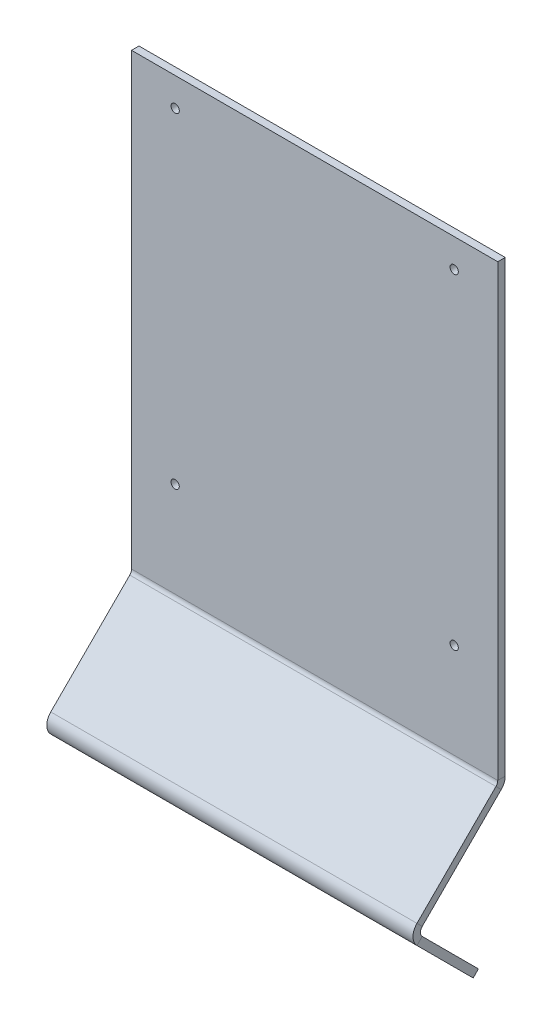
ISO-10303-21;
HEADER;
FILE_DESCRIPTION(('STEP AP214'),'2;1');
FILE_NAME('part.step','',(''),(''),'','','');
FILE_SCHEMA(('AUTOMOTIVE_DESIGN { 1 0 10303 214 1 1 1 1 }'));
ENDSEC;
DATA;
#1=APPLICATION_CONTEXT('core data for automotive mechanical design processes');
#2=APPLICATION_PROTOCOL_DEFINITION('international standard','automotive_design',2000,#1);
#3=PRODUCT_CONTEXT('',#1,'mechanical');
#4=PRODUCT('Part','Part','',(#3));
#5=PRODUCT_RELATED_PRODUCT_CATEGORY('part','',(#4));
#6=PRODUCT_DEFINITION_FORMATION('','',#4);
#7=PRODUCT_DEFINITION_CONTEXT('part definition',#1,'design');
#8=PRODUCT_DEFINITION('design','',#6,#7);
#9=PRODUCT_DEFINITION_SHAPE('','',#8);
#10=(LENGTH_UNIT() NAMED_UNIT(*) SI_UNIT(.MILLI.,.METRE.));
#11=(NAMED_UNIT(*) PLANE_ANGLE_UNIT() SI_UNIT($,.RADIAN.));
#12=(NAMED_UNIT(*) SI_UNIT($,.STERADIAN.) SOLID_ANGLE_UNIT());
#13=UNCERTAINTY_MEASURE_WITH_UNIT(LENGTH_MEASURE(1.E-05),#10,'distance_accuracy_value','');
#14=(GEOMETRIC_REPRESENTATION_CONTEXT(3) GLOBAL_UNCERTAINTY_ASSIGNED_CONTEXT((#13)) GLOBAL_UNIT_ASSIGNED_CONTEXT((#10,
#11,#12)) REPRESENTATION_CONTEXT('',''));
#15=CARTESIAN_POINT('',(0.,0.,0.));
#16=DIRECTION('',(0.,0.,1.));
#17=DIRECTION('',(1.,0.,0.));
#18=AXIS2_PLACEMENT_3D('',#15,#16,#17);
#19=CARTESIAN_POINT('',(0.,-35.7337523480089,-87.6359287137892));
#20=DIRECTION('',(0.,-0.707106781186549,-0.707106781186546));
#21=DIRECTION('',(-1.,0.,0.));
#22=AXIS2_PLACEMENT_3D('',#19,#20,#21);
#23=PLANE('',#22);
#24=DIRECTION('',(0.,-0.707106781186546,0.707106781186549));
#25=VECTOR('',#24,1.);
#26=CARTESIAN_POINT('',(0.,-35.7337523480089,-87.6359287137892));
#27=LINE('',#26,#25);
#28=CARTESIAN_POINT('',(0.,-123.860687253817,0.491006192018879));
#29=VERTEX_POINT('',#28);
#30=CARTESIAN_POINT('',(0.,-145.436843709626,22.0671626478287));
#31=VERTEX_POINT('',#30);
#32=EDGE_CURVE('E70',#29,#31,#27,.T.);
#33=ORIENTED_EDGE('',*,*,#32,.T.);
#34=DIRECTION('',(1.,0.,0.));
#35=VECTOR('',#34,1.);
#36=CARTESIAN_POINT('',(0.,-145.436843709626,22.0671626478287));
#37=LINE('',#36,#35);
#38=CARTESIAN_POINT('',(100.,-145.436843709626,22.0671626478287));
#39=VERTEX_POINT('',#38);
#40=EDGE_CURVE('E62',#31,#39,#37,.T.);
#41=ORIENTED_EDGE('',*,*,#40,.T.);
#42=DIRECTION('',(0.,-0.707106781186546,0.707106781186549));
#43=VECTOR('',#42,1.);
#44=CARTESIAN_POINT('',(100.,-35.7337523480089,-87.6359287137892));
#45=LINE('',#44,#43);
#46=CARTESIAN_POINT('',(100.,-123.860687253817,0.491006192018879));
#47=VERTEX_POINT('',#46);
#48=EDGE_CURVE('E78',#47,#39,#45,.T.);
#49=ORIENTED_EDGE('',*,*,#48,.F.);
#50=DIRECTION('',(1.,0.,0.));
#51=VECTOR('',#50,1.);
#52=CARTESIAN_POINT('',(0.,-123.860687253817,0.491006192018875));
#53=LINE('',#52,#51);
#54=EDGE_CURVE('E242',#29,#47,#53,.T.);
#55=ORIENTED_EDGE('',*,*,#54,.F.);
#56=EDGE_LOOP('',(#33,#41,#49,#55));
#57=FACE_BOUND('',#56,.T.);
#58=ADVANCED_FACE('F53',(#57),#23,.F.);
#59=CARTESIAN_POINT('',(100.,-37.1705933273799,-89.0727696931603));
#60=DIRECTION('',(-1.,0.,0.));
#61=DIRECTION('',(0.,-0.707106781186546,0.707106781186549));
#62=AXIS2_PLACEMENT_3D('',#59,#60,#61);
#63=PLANE('',#62);
#64=ORIENTED_EDGE('',*,*,#48,.T.);
#65=DIRECTION('',(0.,-0.707106781186549,-0.707106781186546));
#66=VECTOR('',#65,1.);
#67=CARTESIAN_POINT('',(100.,-146.873684688997,20.6303216684576));
#68=LINE('',#67,#66);
#69=CARTESIAN_POINT('',(100.,-146.873684688997,20.6303216684576));
#70=VERTEX_POINT('',#69);
#71=EDGE_CURVE('E250',#39,#70,#68,.T.);
#72=ORIENTED_EDGE('',*,*,#71,.T.);
#73=DIRECTION('',(0.,-0.707106781186546,0.707106781186549));
#74=VECTOR('',#73,1.);
#75=CARTESIAN_POINT('',(100.,-37.1705933273799,-89.0727696931603));
#76=LINE('',#75,#74);
#77=CARTESIAN_POINT('',(100.,-125.297528233188,-0.94583478735219));
#78=VERTEX_POINT('',#77);
#79=EDGE_CURVE('E57',#78,#70,#76,.T.);
#80=ORIENTED_EDGE('',*,*,#79,.F.);
#81=DIRECTION('',(0.,-0.707106781186544,-0.707106781186551));
#82=VECTOR('',#81,1.);
#83=CARTESIAN_POINT('',(100.,-125.297528233188,-0.945834787352801));
#84=LINE('',#83,#82);
#85=EDGE_CURVE('E244',#47,#78,#84,.T.);
#86=ORIENTED_EDGE('',*,*,#85,.F.);
#87=EDGE_LOOP('',(#64,#72,#80,#86));
#88=FACE_BOUND('',#87,.T.);
#89=ADVANCED_FACE('F260',(#88),#63,.F.);
#90=CARTESIAN_POINT('',(0.,-37.1705933273799,-89.0727696931603));
#91=DIRECTION('',(-1.,0.,0.));
#92=DIRECTION('',(0.,-0.707106781186546,0.707106781186549));
#93=AXIS2_PLACEMENT_3D('',#90,#91,#92);
#94=PLANE('',#93);
#95=DIRECTION('',(0.,-0.707106781186549,-0.707106781186546));
#96=VECTOR('',#95,1.);
#97=CARTESIAN_POINT('',(0.,-146.873684688997,20.6303216684576));
#98=LINE('',#97,#96);
#99=CARTESIAN_POINT('',(0.,-146.873684688997,20.6303216684576));
#100=VERTEX_POINT('',#99);
#101=EDGE_CURVE('E12',#31,#100,#98,.T.);
#102=ORIENTED_EDGE('',*,*,#101,.F.);
#103=ORIENTED_EDGE('',*,*,#32,.F.);
#104=DIRECTION('',(0.,-0.707106781186544,-0.707106781186551));
#105=VECTOR('',#104,1.);
#106=CARTESIAN_POINT('',(0.,-125.297528233188,-0.945834787352801));
#107=LINE('',#106,#105);
#108=CARTESIAN_POINT('',(0.,-125.297528233188,-0.94583478735218));
#109=VERTEX_POINT('',#108);
#110=EDGE_CURVE('E238',#29,#109,#107,.T.);
#111=ORIENTED_EDGE('',*,*,#110,.T.);
#112=DIRECTION('',(0.,-0.707106781186546,0.707106781186549));
#113=VECTOR('',#112,1.);
#114=CARTESIAN_POINT('',(0.,-37.1705933273799,-89.0727696931603));
#115=LINE('',#114,#113);
#116=EDGE_CURVE('E239',#109,#100,#115,.T.);
#117=ORIENTED_EDGE('',*,*,#116,.T.);
#118=EDGE_LOOP('',(#102,#103,#111,#117));
#119=FACE_BOUND('',#118,.T.);
#120=ADVANCED_FACE('F55',(#119),#94,.T.);
#121=CARTESIAN_POINT('',(0.,-37.1705933273799,-89.0727696931603));
#122=DIRECTION('',(0.,-0.707106781186549,-0.707106781186546));
#123=DIRECTION('',(-1.,0.,0.));
#124=AXIS2_PLACEMENT_3D('',#121,#122,#123);
#125=PLANE('',#124);
#126=DIRECTION('',(1.,0.,0.));
#127=VECTOR('',#126,1.);
#128=CARTESIAN_POINT('',(0.,-146.873684688997,20.6303216684576));
#129=LINE('',#128,#127);
#130=EDGE_CURVE('E247',#100,#70,#129,.T.);
#131=ORIENTED_EDGE('',*,*,#130,.F.);
#132=ORIENTED_EDGE('',*,*,#116,.F.);
#133=DIRECTION('',(1.,0.,0.));
#134=VECTOR('',#133,1.);
#135=CARTESIAN_POINT('',(0.,-125.297528233188,-0.94583478735219));
#136=LINE('',#135,#134);
#137=EDGE_CURVE('E235',#109,#78,#136,.T.);
#138=ORIENTED_EDGE('',*,*,#137,.T.);
#139=ORIENTED_EDGE('',*,*,#79,.T.);
#140=EDGE_LOOP('',(#131,#132,#138,#139));
#141=FACE_BOUND('',#140,.T.);
#142=ADVANCED_FACE('F257',(#141),#125,.T.);
#143=CARTESIAN_POINT('',(0.,0.,-2.032));
#144=DIRECTION('',(0.,-1.,0.));
#145=DIRECTION('',(0.,0.,-1.));
#146=AXIS2_PLACEMENT_3D('',#143,#144,#145);
#147=PLANE('',#146);
#148=DIRECTION('',(1.,0.,0.));
#149=VECTOR('',#148,1.);
#150=CARTESIAN_POINT('',(0.,0.,0.));
#151=LINE('',#150,#149);
#152=CARTESIAN_POINT('',(0.,0.,0.));
#153=VERTEX_POINT('',#152);
#154=CARTESIAN_POINT('',(100.,0.,0.));
#155=VERTEX_POINT('',#154);
#156=EDGE_CURVE('E228',#153,#155,#151,.T.);
#157=ORIENTED_EDGE('',*,*,#156,.T.);
#158=DIRECTION('',(0.,0.,1.));
#159=VECTOR('',#158,1.);
#160=CARTESIAN_POINT('',(100.,0.,-2.032));
#161=LINE('',#160,#159);
#162=CARTESIAN_POINT('',(100.,0.,-2.032));
#163=VERTEX_POINT('',#162);
#164=EDGE_CURVE('E207',#163,#155,#161,.T.);
#165=ORIENTED_EDGE('',*,*,#164,.F.);
#166=DIRECTION('',(1.,0.,0.));
#167=VECTOR('',#166,1.);
#168=CARTESIAN_POINT('',(0.,0.,-2.032));
#169=LINE('',#168,#167);
#170=CARTESIAN_POINT('',(0.,0.,-2.032));
#171=VERTEX_POINT('',#170);
#172=EDGE_CURVE('E224',#171,#163,#169,.T.);
#173=ORIENTED_EDGE('',*,*,#172,.F.);
#174=DIRECTION('',(0.,0.,1.));
#175=VECTOR('',#174,1.);
#176=CARTESIAN_POINT('',(0.,0.,-2.032));
#177=LINE('',#176,#175);
#178=EDGE_CURVE('E226',#171,#153,#177,.T.);
#179=ORIENTED_EDGE('',*,*,#178,.T.);
#180=EDGE_LOOP('',(#157,#165,#173,#179));
#181=FACE_BOUND('',#180,.T.);
#182=ADVANCED_FACE('F362',(#181),#147,.F.);
#183=CARTESIAN_POINT('',(0.,0.,-2.032));
#184=DIRECTION('',(0.,0.,-1.));
#185=DIRECTION('',(-1.,0.,0.));
#186=AXIS2_PLACEMENT_3D('',#183,#184,#185);
#187=PLANE('',#186);
#188=CARTESIAN_POINT('',(88.1,-96.6868,-2.032));
#189=DIRECTION('',(0.,0.,1.));
#190=DIRECTION('',(1.,0.,0.));
#191=AXIS2_PLACEMENT_3D('',#188,#189,#190);
#192=CIRCLE('',#191,1.1303);
#193=CARTESIAN_POINT('',(89.2303,-96.6868,-2.032));
#194=VERTEX_POINT('',#193);
#195=EDGE_CURVE('E305',#194,#194,#192,.T.);
#196=ORIENTED_EDGE('',*,*,#195,.T.);
#197=EDGE_LOOP('',(#196));
#198=FACE_BOUND('',#197,.T.);
#199=CARTESIAN_POINT('',(11.9,-96.6868,-2.032));
#200=DIRECTION('',(0.,0.,1.));
#201=DIRECTION('',(1.,0.,0.));
#202=AXIS2_PLACEMENT_3D('',#199,#200,#201);
#203=CIRCLE('',#202,1.1303);
#204=CARTESIAN_POINT('',(13.0303,-96.6868,-2.032));
#205=VERTEX_POINT('',#204);
#206=EDGE_CURVE('E299',#205,#205,#203,.T.);
#207=ORIENTED_EDGE('',*,*,#206,.T.);
#208=EDGE_LOOP('',(#207));
#209=FACE_BOUND('',#208,.T.);
#210=CARTESIAN_POINT('',(11.9,-7.7868,-2.032));
#211=DIRECTION('',(0.,0.,1.));
#212=DIRECTION('',(1.,0.,0.));
#213=AXIS2_PLACEMENT_3D('',#210,#211,#212);
#214=CIRCLE('',#213,1.1303);
#215=CARTESIAN_POINT('',(13.0303,-7.7868,-2.032));
#216=VERTEX_POINT('',#215);
#217=EDGE_CURVE('E293',#216,#216,#214,.T.);
#218=ORIENTED_EDGE('',*,*,#217,.T.);
#219=EDGE_LOOP('',(#218));
#220=FACE_BOUND('',#219,.T.);
#221=CARTESIAN_POINT('',(88.1,-7.78679999999999,-2.032));
#222=DIRECTION('',(0.,0.,1.));
#223=DIRECTION('',(1.,0.,0.));
#224=AXIS2_PLACEMENT_3D('',#221,#222,#223);
#225=CIRCLE('',#224,1.1303);
#226=CARTESIAN_POINT('',(89.2303,-7.78679999999999,-2.032));
#227=VERTEX_POINT('',#226);
#228=EDGE_CURVE('E183',#227,#227,#225,.T.);
#229=ORIENTED_EDGE('',*,*,#228,.T.);
#230=EDGE_LOOP('',(#229));
#231=FACE_BOUND('',#230,.T.);
#232=DIRECTION('',(1.,0.,0.));
#233=VECTOR('',#232,1.);
#234=CARTESIAN_POINT('',(0.,-122.675293445836,-2.032));
#235=LINE('',#234,#233);
#236=CARTESIAN_POINT('',(0.,-122.675293445836,-2.032));
#237=VERTEX_POINT('',#236);
#238=CARTESIAN_POINT('',(100.,-122.675293445836,-2.032));
#239=VERTEX_POINT('',#238);
#240=EDGE_CURVE('E202',#237,#239,#235,.T.);
#241=ORIENTED_EDGE('',*,*,#240,.F.);
#242=DIRECTION('',(0.,-1.,0.));
#243=VECTOR('',#242,1.);
#244=CARTESIAN_POINT('',(0.,0.,-2.032));
#245=LINE('',#244,#243);
#246=EDGE_CURVE('E220',#171,#237,#245,.T.);
#247=ORIENTED_EDGE('',*,*,#246,.F.);
#248=ORIENTED_EDGE('',*,*,#172,.T.);
#249=DIRECTION('',(0.,-1.,0.));
#250=VECTOR('',#249,1.);
#251=CARTESIAN_POINT('',(100.,0.,-2.032));
#252=LINE('',#251,#250);
#253=EDGE_CURVE('E222',#163,#239,#252,.T.);
#254=ORIENTED_EDGE('',*,*,#253,.T.);
#255=EDGE_LOOP('',(#241,#247,#248,#254));
#256=FACE_BOUND('',#255,.T.);
#257=ADVANCED_FACE('F375',(#198,#209,#220,#231,#256),#187,.T.);
#258=CARTESIAN_POINT('',(0.,0.,-2.032));
#259=DIRECTION('',(-1.,0.,0.));
#260=DIRECTION('',(0.,-1.,0.));
#261=AXIS2_PLACEMENT_3D('',#258,#259,#260);
#262=PLANE('',#261);
#263=DIRECTION('',(0.,0.,-1.));
#264=VECTOR('',#263,1.);
#265=CARTESIAN_POINT('',(0.,-122.675293445836,-2.03200000000086));
#266=LINE('',#265,#264);
#267=CARTESIAN_POINT('',(0.,-122.675293445836,0.));
#268=VERTEX_POINT('',#267);
#269=EDGE_CURVE('E230',#268,#237,#266,.T.);
#270=ORIENTED_EDGE('',*,*,#269,.F.);
#271=DIRECTION('',(0.,-1.,0.));
#272=VECTOR('',#271,1.);
#273=CARTESIAN_POINT('',(0.,0.,0.));
#274=LINE('',#273,#272);
#275=EDGE_CURVE('E218',#153,#268,#274,.T.);
#276=ORIENTED_EDGE('',*,*,#275,.F.);
#277=ORIENTED_EDGE('',*,*,#178,.F.);
#278=ORIENTED_EDGE('',*,*,#246,.T.);
#279=EDGE_LOOP('',(#270,#276,#277,#278));
#280=FACE_BOUND('',#279,.T.);
#281=ADVANCED_FACE('F371',(#280),#262,.T.);
#282=CARTESIAN_POINT('',(0.,0.,0.));
#283=DIRECTION('',(0.,0.,-1.));
#284=DIRECTION('',(-1.,0.,0.));
#285=AXIS2_PLACEMENT_3D('',#282,#283,#284);
#286=PLANE('',#285);
#287=CARTESIAN_POINT('',(88.1,-96.6868,0.));
#288=DIRECTION('',(0.,0.,1.));
#289=DIRECTION('',(1.,0.,0.));
#290=AXIS2_PLACEMENT_3D('',#287,#288,#289);
#291=CIRCLE('',#290,1.13029999999999);
#292=CARTESIAN_POINT('',(89.2303,-96.6868,0.));
#293=VERTEX_POINT('',#292);
#294=EDGE_CURVE('E308',#293,#293,#291,.T.);
#295=ORIENTED_EDGE('',*,*,#294,.F.);
#296=EDGE_LOOP('',(#295));
#297=FACE_BOUND('',#296,.T.);
#298=CARTESIAN_POINT('',(11.9,-96.6868,0.));
#299=DIRECTION('',(0.,0.,1.));
#300=DIRECTION('',(1.,0.,0.));
#301=AXIS2_PLACEMENT_3D('',#298,#299,#300);
#302=CIRCLE('',#301,1.13029999999999);
#303=CARTESIAN_POINT('',(13.0303,-96.6868,0.));
#304=VERTEX_POINT('',#303);
#305=EDGE_CURVE('E302',#304,#304,#302,.T.);
#306=ORIENTED_EDGE('',*,*,#305,.F.);
#307=EDGE_LOOP('',(#306));
#308=FACE_BOUND('',#307,.T.);
#309=CARTESIAN_POINT('',(11.9,-7.7868,0.));
#310=DIRECTION('',(0.,0.,1.));
#311=DIRECTION('',(1.,0.,0.));
#312=AXIS2_PLACEMENT_3D('',#309,#310,#311);
#313=CIRCLE('',#312,1.13029999999999);
#314=CARTESIAN_POINT('',(13.0303,-7.7868,0.));
#315=VERTEX_POINT('',#314);
#316=EDGE_CURVE('E296',#315,#315,#313,.T.);
#317=ORIENTED_EDGE('',*,*,#316,.F.);
#318=EDGE_LOOP('',(#317));
#319=FACE_BOUND('',#318,.T.);
#320=CARTESIAN_POINT('',(88.1,-7.78679999999999,0.));
#321=DIRECTION('',(0.,0.,1.));
#322=DIRECTION('',(1.,0.,0.));
#323=AXIS2_PLACEMENT_3D('',#320,#321,#322);
#324=CIRCLE('',#323,1.13029999999999);
#325=CARTESIAN_POINT('',(89.2303,-7.78679999999999,0.));
#326=VERTEX_POINT('',#325);
#327=EDGE_CURVE('E290',#326,#326,#324,.T.);
#328=ORIENTED_EDGE('',*,*,#327,.F.);
#329=EDGE_LOOP('',(#328));
#330=FACE_BOUND('',#329,.T.);
#331=ORIENTED_EDGE('',*,*,#275,.T.);
#332=DIRECTION('',(1.,0.,0.));
#333=VECTOR('',#332,1.);
#334=CARTESIAN_POINT('',(0.,-122.675293445836,0.));
#335=LINE('',#334,#333);
#336=CARTESIAN_POINT('',(100.,-122.675293445836,0.));
#337=VERTEX_POINT('',#336);
#338=EDGE_CURVE('E215',#268,#337,#335,.T.);
#339=ORIENTED_EDGE('',*,*,#338,.T.);
#340=DIRECTION('',(0.,-1.,0.));
#341=VECTOR('',#340,1.);
#342=CARTESIAN_POINT('',(100.,0.,0.));
#343=LINE('',#342,#341);
#344=EDGE_CURVE('E213',#155,#337,#343,.T.);
#345=ORIENTED_EDGE('',*,*,#344,.F.);
#346=ORIENTED_EDGE('',*,*,#156,.F.);
#347=EDGE_LOOP('',(#331,#339,#345,#346));
#348=FACE_BOUND('',#347,.T.);
#349=ADVANCED_FACE('F367',(#297,#308,#319,#330,#348),#286,.F.);
#350=CARTESIAN_POINT('',(100.,0.,-2.032));
#351=DIRECTION('',(-1.,0.,0.));
#352=DIRECTION('',(0.,-1.,0.));
#353=AXIS2_PLACEMENT_3D('',#350,#351,#352);
#354=PLANE('',#353);
#355=ORIENTED_EDGE('',*,*,#344,.T.);
#356=DIRECTION('',(0.,0.,-1.));
#357=VECTOR('',#356,1.);
#358=CARTESIAN_POINT('',(100.,-122.675293445836,-2.03200000000086));
#359=LINE('',#358,#357);
#360=EDGE_CURVE('E210',#337,#239,#359,.T.);
#361=ORIENTED_EDGE('',*,*,#360,.T.);
#362=ORIENTED_EDGE('',*,*,#253,.F.);
#363=ORIENTED_EDGE('',*,*,#164,.T.);
#364=EDGE_LOOP('',(#355,#361,#362,#363));
#365=FACE_BOUND('',#364,.T.);
#366=ADVANCED_FACE('F363',(#365),#354,.F.);
#367=CARTESIAN_POINT('',(0.,-122.675293445836,1.6764));
#368=DIRECTION('',(-1.,0.,0.));
#369=DIRECTION('',(0.,0.,1.));
#370=AXIS2_PLACEMENT_3D('',#367,#368,#369);
#371=PLANE('',#370);
#372=ORIENTED_EDGE('',*,*,#110,.F.);
#373=CARTESIAN_POINT('',(0.,-122.675293445836,1.6764));
#374=DIRECTION('',(-1.,0.,0.));
#375=DIRECTION('',(0.,0.,1.));
#376=AXIS2_PLACEMENT_3D('',#373,#374,#375);
#377=CIRCLE('',#376,1.6764);
#378=EDGE_CURVE('E191',#29,#268,#377,.F.);
#379=ORIENTED_EDGE('',*,*,#378,.T.);
#380=ORIENTED_EDGE('',*,*,#269,.T.);
#381=CARTESIAN_POINT('',(0.,-122.675293445836,1.6764));
#382=DIRECTION('',(1.,0.,0.));
#383=DIRECTION('',(0.,0.,1.));
#384=AXIS2_PLACEMENT_3D('',#381,#382,#383);
#385=CIRCLE('',#384,3.7084);
#386=EDGE_CURVE('E196',#109,#237,#385,.T.);
#387=ORIENTED_EDGE('',*,*,#386,.F.);
#388=EDGE_LOOP('',(#372,#379,#380,#387));
#389=FACE_BOUND('',#388,.T.);
#390=ADVANCED_FACE('F366',(#389),#371,.T.);
#391=CARTESIAN_POINT('',(100.,-122.675293445836,1.6764));
#392=DIRECTION('',(1.,0.,0.));
#393=DIRECTION('',(0.,0.,-1.));
#394=AXIS2_PLACEMENT_3D('',#391,#392,#393);
#395=PLANE('',#394);
#396=CARTESIAN_POINT('',(100.,-122.675293445836,1.6764));
#397=DIRECTION('',(-1.,0.,0.));
#398=DIRECTION('',(0.,0.,1.));
#399=AXIS2_PLACEMENT_3D('',#396,#397,#398);
#400=CIRCLE('',#399,1.6764);
#401=EDGE_CURVE('E200',#337,#47,#400,.T.);
#402=ORIENTED_EDGE('',*,*,#401,.T.);
#403=ORIENTED_EDGE('',*,*,#85,.T.);
#404=CARTESIAN_POINT('',(100.,-122.675293445836,1.6764));
#405=DIRECTION('',(-1.,0.,0.));
#406=DIRECTION('',(0.,0.,1.));
#407=AXIS2_PLACEMENT_3D('',#404,#405,#406);
#408=CIRCLE('',#407,3.7084);
#409=EDGE_CURVE('E199',#239,#78,#408,.T.);
#410=ORIENTED_EDGE('',*,*,#409,.F.);
#411=ORIENTED_EDGE('',*,*,#360,.F.);
#412=EDGE_LOOP('',(#402,#403,#410,#411));
#413=FACE_BOUND('',#412,.T.);
#414=ADVANCED_FACE('F383',(#413),#395,.T.);
#415=CARTESIAN_POINT('',(150.039747601909,-122.675293445836,1.6764));
#416=DIRECTION('',(-1.,0.,0.));
#417=DIRECTION('',(0.,0.,1.));
#418=AXIS2_PLACEMENT_3D('',#415,#416,#417);
#419=CYLINDRICAL_SURFACE('',#418,3.7084);
#420=ORIENTED_EDGE('',*,*,#240,.T.);
#421=ORIENTED_EDGE('',*,*,#409,.T.);
#422=ORIENTED_EDGE('',*,*,#137,.F.);
#423=ORIENTED_EDGE('',*,*,#386,.T.);
#424=EDGE_LOOP('',(#420,#421,#422,#423));
#425=FACE_BOUND('',#424,.T.);
#426=ADVANCED_FACE('F386',(#425),#419,.T.);
#427=CARTESIAN_POINT('',(150.039747601909,-122.675293445836,1.6764));
#428=DIRECTION('',(-1.,0.,0.));
#429=DIRECTION('',(0.,0.,1.));
#430=AXIS2_PLACEMENT_3D('',#427,#428,#429);
#431=CYLINDRICAL_SURFACE('',#430,1.6764);
#432=ORIENTED_EDGE('',*,*,#338,.F.);
#433=ORIENTED_EDGE('',*,*,#378,.F.);
#434=ORIENTED_EDGE('',*,*,#54,.T.);
#435=ORIENTED_EDGE('',*,*,#401,.F.);
#436=EDGE_LOOP('',(#432,#433,#434,#435));
#437=FACE_BOUND('',#436,.T.);
#438=ADVANCED_FACE('F391',(#437),#431,.F.);
#439=CARTESIAN_POINT('',(0.,-148.059078496979,19.4449278604765));
#440=DIRECTION('',(1.,0.,0.));
#441=DIRECTION('',(0.,0.,-1.));
#442=AXIS2_PLACEMENT_3D('',#439,#440,#441);
#443=PLANE('',#442);
#444=DIRECTION('',(0.,0.707106781186549,-0.707106781186546));
#445=VECTOR('',#444,1.);
#446=CARTESIAN_POINT('',(0.,-149.24447230496,20.6303216684576));
#447=LINE('',#446,#445);
#448=CARTESIAN_POINT('',(0.,-150.681313284331,22.0671626478286));
#449=VERTEX_POINT('',#448);
#450=CARTESIAN_POINT('',(0.,-149.24447230496,20.6303216684576));
#451=VERTEX_POINT('',#450);
#452=EDGE_CURVE('E153',#449,#451,#447,.T.);
#453=ORIENTED_EDGE('',*,*,#452,.F.);
#454=CARTESIAN_POINT('',(0.,-148.059078496979,19.4449278604765));
#455=DIRECTION('',(-1.,0.,0.));
#456=DIRECTION('',(0.,0.,1.));
#457=AXIS2_PLACEMENT_3D('',#454,#455,#456);
#458=CIRCLE('',#457,3.7084);
#459=EDGE_CURVE('E165',#449,#31,#458,.T.);
#460=ORIENTED_EDGE('',*,*,#459,.T.);
#461=ORIENTED_EDGE('',*,*,#101,.T.);
#462=CARTESIAN_POINT('',(0.,-148.059078496979,19.4449278604765));
#463=DIRECTION('',(-1.,0.,0.));
#464=DIRECTION('',(0.,0.,-1.));
#465=AXIS2_PLACEMENT_3D('',#462,#463,#464);
#466=CIRCLE('',#465,1.6764);
#467=EDGE_CURVE('E184',#451,#100,#466,.T.);
#468=ORIENTED_EDGE('',*,*,#467,.F.);
#469=EDGE_LOOP('',(#453,#460,#461,#468));
#470=FACE_BOUND('',#469,.T.);
#471=ADVANCED_FACE('F281',(#470),#443,.F.);
#472=CARTESIAN_POINT('',(100.,-148.059078496979,19.4449278604765));
#473=DIRECTION('',(-1.,0.,0.));
#474=DIRECTION('',(0.,0.,1.));
#475=AXIS2_PLACEMENT_3D('',#472,#473,#474);
#476=PLANE('',#475);
#477=CARTESIAN_POINT('',(100.,-148.059078496979,19.4449278604765));
#478=DIRECTION('',(-1.,0.,0.));
#479=DIRECTION('',(0.,0.,1.));
#480=AXIS2_PLACEMENT_3D('',#477,#478,#479);
#481=CIRCLE('',#480,3.7084);
#482=CARTESIAN_POINT('',(100.,-150.681313284331,22.0671626478286));
#483=VERTEX_POINT('',#482);
#484=EDGE_CURVE('E188',#39,#483,#481,.F.);
#485=ORIENTED_EDGE('',*,*,#484,.T.);
#486=DIRECTION('',(0.,0.707106781186549,-0.707106781186546));
#487=VECTOR('',#486,1.);
#488=CARTESIAN_POINT('',(100.,-149.24447230496,20.6303216684576));
#489=LINE('',#488,#487);
#490=CARTESIAN_POINT('',(100.,-149.24447230496,20.6303216684575));
#491=VERTEX_POINT('',#490);
#492=EDGE_CURVE('E172',#483,#491,#489,.T.);
#493=ORIENTED_EDGE('',*,*,#492,.T.);
#494=CARTESIAN_POINT('',(100.,-148.059078496979,19.4449278604765));
#495=DIRECTION('',(1.,0.,0.));
#496=DIRECTION('',(0.,0.,-1.));
#497=AXIS2_PLACEMENT_3D('',#494,#495,#496);
#498=CIRCLE('',#497,1.67640000000001);
#499=EDGE_CURVE('E187',#70,#491,#498,.T.);
#500=ORIENTED_EDGE('',*,*,#499,.F.);
#501=ORIENTED_EDGE('',*,*,#71,.F.);
#502=EDGE_LOOP('',(#485,#493,#500,#501));
#503=FACE_BOUND('',#502,.T.);
#504=ADVANCED_FACE('F267',(#503),#476,.F.);
#505=CARTESIAN_POINT('',(150.176382823296,-148.059078496979,19.4449278604765));
#506=DIRECTION('',(-1.,0.,0.));
#507=DIRECTION('',(0.,0.,1.));
#508=AXIS2_PLACEMENT_3D('',#505,#506,#507);
#509=CYLINDRICAL_SURFACE('',#508,1.6764);
#510=ORIENTED_EDGE('',*,*,#130,.T.);
#511=ORIENTED_EDGE('',*,*,#499,.T.);
#512=DIRECTION('',(1.,0.,0.));
#513=VECTOR('',#512,1.);
#514=CARTESIAN_POINT('',(0.,-149.24447230496,20.6303216684576));
#515=LINE('',#514,#513);
#516=EDGE_CURVE('E174',#451,#491,#515,.T.);
#517=ORIENTED_EDGE('',*,*,#516,.F.);
#518=ORIENTED_EDGE('',*,*,#467,.T.);
#519=EDGE_LOOP('',(#510,#511,#517,#518));
#520=FACE_BOUND('',#519,.T.);
#521=ADVANCED_FACE('F265',(#520),#509,.F.);
#522=CARTESIAN_POINT('',(150.176382823296,-148.059078496979,19.4449278604765));
#523=DIRECTION('',(-1.,0.,0.));
#524=DIRECTION('',(0.,0.,1.));
#525=AXIS2_PLACEMENT_3D('',#522,#523,#524);
#526=CYLINDRICAL_SURFACE('',#525,3.7084);
#527=ORIENTED_EDGE('',*,*,#40,.F.);
#528=ORIENTED_EDGE('',*,*,#459,.F.);
#529=DIRECTION('',(1.,0.,0.));
#530=VECTOR('',#529,1.);
#531=CARTESIAN_POINT('',(0.,-150.681313284331,22.0671626478286));
#532=LINE('',#531,#530);
#533=EDGE_CURVE('E177',#449,#483,#532,.T.);
#534=ORIENTED_EDGE('',*,*,#533,.T.);
#535=ORIENTED_EDGE('',*,*,#484,.F.);
#536=EDGE_LOOP('',(#527,#528,#534,#535));
#537=FACE_BOUND('',#536,.T.);
#538=ADVANCED_FACE('F276',(#537),#526,.T.);
#539=CARTESIAN_POINT('',(0.,-164.604651788062,5.27014218535557));
#540=DIRECTION('',(0.,-0.707106781186546,-0.707106781186549));
#541=DIRECTION('',(0.,0.707106781186549,-0.707106781186546));
#542=AXIS2_PLACEMENT_3D('',#539,#540,#541);
#543=PLANE('',#542);
#544=DIRECTION('',(1.,0.,0.));
#545=VECTOR('',#544,1.);
#546=CARTESIAN_POINT('',(0.,-166.041492767433,6.70698316472665));
#547=LINE('',#546,#545);
#548=CARTESIAN_POINT('',(0.,-166.041492767433,6.70698316472665));
#549=VERTEX_POINT('',#548);
#550=CARTESIAN_POINT('',(100.,-166.041492767433,6.70698316472665));
#551=VERTEX_POINT('',#550);
#552=EDGE_CURVE('E164',#549,#551,#547,.T.);
#553=ORIENTED_EDGE('',*,*,#552,.F.);
#554=DIRECTION('',(0.,-0.707106781186549,0.707106781186546));
#555=VECTOR('',#554,1.);
#556=CARTESIAN_POINT('',(0.,-164.604651788062,5.27014218535557));
#557=LINE('',#556,#555);
#558=CARTESIAN_POINT('',(0.,-164.604651788062,5.27014218535557));
#559=VERTEX_POINT('',#558);
#560=EDGE_CURVE('E150',#559,#549,#557,.T.);
#561=ORIENTED_EDGE('',*,*,#560,.F.);
#562=DIRECTION('',(1.,0.,0.));
#563=VECTOR('',#562,1.);
#564=CARTESIAN_POINT('',(0.,-164.604651788062,5.27014218535557));
#565=LINE('',#564,#563);
#566=CARTESIAN_POINT('',(100.,-164.604651788062,5.27014218535557));
#567=VERTEX_POINT('',#566);
#568=EDGE_CURVE('E162',#559,#567,#565,.T.);
#569=ORIENTED_EDGE('',*,*,#568,.T.);
#570=DIRECTION('',(0.,-0.707106781186549,0.707106781186546));
#571=VECTOR('',#570,1.);
#572=CARTESIAN_POINT('',(100.,-164.604651788062,5.27014218535557));
#573=LINE('',#572,#571);
#574=EDGE_CURVE('E171',#567,#551,#573,.T.);
#575=ORIENTED_EDGE('',*,*,#574,.T.);
#576=EDGE_LOOP('',(#553,#561,#569,#575));
#577=FACE_BOUND('',#576,.T.);
#578=ADVANCED_FACE('F160',(#577),#543,.T.);
#579=CARTESIAN_POINT('',(0.,-36.7765748909263,133.098219082491));
#580=DIRECTION('',(0.,0.707106781186549,-0.707106781186546));
#581=DIRECTION('',(-1.,0.,0.));
#582=AXIS2_PLACEMENT_3D('',#579,#580,#581);
#583=PLANE('',#582);
#584=CARTESIAN_POINT('',(90.,-155.624395666993,14.2503983064248));
#585=DIRECTION('',(0.,0.707106781186549,-0.707106781186546));
#586=DIRECTION('',(0.,0.707106781186546,0.707106781186549));
#587=AXIS2_PLACEMENT_3D('',#584,#585,#586);
#588=CIRCLE('',#587,2.55269999999998);
#589=CARTESIAN_POINT('',(90.,-153.819364186658,16.0554297867597));
#590=VERTEX_POINT('',#589);
#591=EDGE_CURVE('E323',#590,#590,#588,.T.);
#592=ORIENTED_EDGE('',*,*,#591,.F.);
#593=EDGE_LOOP('',(#592));
#594=FACE_BOUND('',#593,.T.);
#595=CARTESIAN_POINT('',(50.,-155.624395666993,14.2503983064247));
#596=DIRECTION('',(0.,0.707106781186549,-0.707106781186546));
#597=DIRECTION('',(0.,0.707106781186546,0.707106781186549));
#598=AXIS2_PLACEMENT_3D('',#595,#596,#597);
#599=CIRCLE('',#598,2.55269999999998);
#600=CARTESIAN_POINT('',(50.,-153.819364186658,16.0554297867596));
#601=VERTEX_POINT('',#600);
#602=EDGE_CURVE('E317',#601,#601,#599,.T.);
#603=ORIENTED_EDGE('',*,*,#602,.F.);
#604=EDGE_LOOP('',(#603));
#605=FACE_BOUND('',#604,.T.);
#606=CARTESIAN_POINT('',(10.,-155.624395666993,14.2503983064247));
#607=DIRECTION('',(0.,0.707106781186549,-0.707106781186546));
#608=DIRECTION('',(0.,0.707106781186546,0.707106781186549));
#609=AXIS2_PLACEMENT_3D('',#606,#607,#608);
#610=CIRCLE('',#609,2.55269999999998);
#611=CARTESIAN_POINT('',(10.,-153.819364186658,16.0554297867596));
#612=VERTEX_POINT('',#611);
#613=EDGE_CURVE('E311',#612,#612,#610,.T.);
#614=ORIENTED_EDGE('',*,*,#613,.F.);
#615=EDGE_LOOP('',(#614));
#616=FACE_BOUND('',#615,.T.);
#617=DIRECTION('',(0.,-0.707106781186546,-0.707106781186549));
#618=VECTOR('',#617,1.);
#619=CARTESIAN_POINT('',(0.,-36.7765748909263,133.098219082491));
#620=LINE('',#619,#618);
#621=EDGE_CURVE('E147',#451,#559,#620,.T.);
#622=ORIENTED_EDGE('',*,*,#621,.F.);
#623=ORIENTED_EDGE('',*,*,#516,.T.);
#624=DIRECTION('',(0.,-0.707106781186546,-0.707106781186549));
#625=VECTOR('',#624,1.);
#626=CARTESIAN_POINT('',(100.,-36.7765748909263,133.098219082491));
#627=LINE('',#626,#625);
#628=EDGE_CURVE('E169',#491,#567,#627,.T.);
#629=ORIENTED_EDGE('',*,*,#628,.T.);
#630=ORIENTED_EDGE('',*,*,#568,.F.);
#631=EDGE_LOOP('',(#622,#623,#629,#630));
#632=FACE_BOUND('',#631,.T.);
#633=ADVANCED_FACE('F167',(#594,#605,#616,#632),#583,.T.);
#634=CARTESIAN_POINT('',(100.,-36.7765748909263,133.098219082491));
#635=DIRECTION('',(-1.,0.,0.));
#636=DIRECTION('',(0.,-0.707106781186546,-0.707106781186549));
#637=AXIS2_PLACEMENT_3D('',#634,#635,#636);
#638=PLANE('',#637);
#639=ORIENTED_EDGE('',*,*,#492,.F.);
#640=DIRECTION('',(0.,-0.707106781186546,-0.707106781186549));
#641=VECTOR('',#640,1.);
#642=CARTESIAN_POINT('',(100.,-38.2134158702973,134.535060061862));
#643=LINE('',#642,#641);
#644=EDGE_CURVE('E271',#483,#551,#643,.T.);
#645=ORIENTED_EDGE('',*,*,#644,.T.);
#646=ORIENTED_EDGE('',*,*,#574,.F.);
#647=ORIENTED_EDGE('',*,*,#628,.F.);
#648=EDGE_LOOP('',(#639,#645,#646,#647));
#649=FACE_BOUND('',#648,.T.);
#650=ADVANCED_FACE('F270',(#649),#638,.F.);
#651=CARTESIAN_POINT('',(0.,-38.2134158702973,134.535060061862));
#652=DIRECTION('',(0.,0.707106781186549,-0.707106781186546));
#653=DIRECTION('',(-1.,0.,0.));
#654=AXIS2_PLACEMENT_3D('',#651,#652,#653);
#655=PLANE('',#654);
#656=CARTESIAN_POINT('',(90.,-157.061236646364,15.6872392857959));
#657=DIRECTION('',(0.,-0.707106781186549,0.707106781186546));
#658=DIRECTION('',(0.,-0.707106781186546,-0.707106781186549));
#659=AXIS2_PLACEMENT_3D('',#656,#657,#658);
#660=CIRCLE('',#659,2.55269999999999);
#661=CARTESIAN_POINT('',(90.,-158.866268126699,13.882207805461));
#662=VERTEX_POINT('',#661);
#663=EDGE_CURVE('E326',#662,#662,#660,.T.);
#664=ORIENTED_EDGE('',*,*,#663,.F.);
#665=EDGE_LOOP('',(#664));
#666=FACE_BOUND('',#665,.T.);
#667=CARTESIAN_POINT('',(50.,-157.061236646364,15.6872392857958));
#668=DIRECTION('',(0.,-0.707106781186549,0.707106781186546));
#669=DIRECTION('',(0.,-0.707106781186546,-0.707106781186549));
#670=AXIS2_PLACEMENT_3D('',#667,#668,#669);
#671=CIRCLE('',#670,2.55269999999998);
#672=CARTESIAN_POINT('',(50.,-158.866268126699,13.8822078054609));
#673=VERTEX_POINT('',#672);
#674=EDGE_CURVE('E320',#673,#673,#671,.T.);
#675=ORIENTED_EDGE('',*,*,#674,.F.);
#676=EDGE_LOOP('',(#675));
#677=FACE_BOUND('',#676,.T.);
#678=CARTESIAN_POINT('',(10.,-157.061236646364,15.6872392857958));
#679=DIRECTION('',(0.,-0.707106781186549,0.707106781186546));
#680=DIRECTION('',(0.,-0.707106781186546,-0.707106781186549));
#681=AXIS2_PLACEMENT_3D('',#678,#679,#680);
#682=CIRCLE('',#681,2.55269999999999);
#683=CARTESIAN_POINT('',(10.,-158.866268126699,13.8822078054609));
#684=VERTEX_POINT('',#683);
#685=EDGE_CURVE('E314',#684,#684,#682,.T.);
#686=ORIENTED_EDGE('',*,*,#685,.F.);
#687=EDGE_LOOP('',(#686));
#688=FACE_BOUND('',#687,.T.);
#689=ORIENTED_EDGE('',*,*,#533,.F.);
#690=DIRECTION('',(0.,-0.707106781186546,-0.707106781186549));
#691=VECTOR('',#690,1.);
#692=CARTESIAN_POINT('',(0.,-38.2134158702973,134.535060061862));
#693=LINE('',#692,#691);
#694=EDGE_CURVE('E279',#449,#549,#693,.T.);
#695=ORIENTED_EDGE('',*,*,#694,.T.);
#696=ORIENTED_EDGE('',*,*,#552,.T.);
#697=ORIENTED_EDGE('',*,*,#644,.F.);
#698=EDGE_LOOP('',(#689,#695,#696,#697));
#699=FACE_BOUND('',#698,.T.);
#700=ADVANCED_FACE('F278',(#666,#677,#688,#699),#655,.F.);
#701=CARTESIAN_POINT('',(0.,-36.7765748909263,133.098219082491));
#702=DIRECTION('',(-1.,0.,0.));
#703=DIRECTION('',(0.,-0.707106781186546,-0.707106781186549));
#704=AXIS2_PLACEMENT_3D('',#701,#702,#703);
#705=PLANE('',#704);
#706=ORIENTED_EDGE('',*,*,#694,.F.);
#707=ORIENTED_EDGE('',*,*,#452,.T.);
#708=ORIENTED_EDGE('',*,*,#621,.T.);
#709=ORIENTED_EDGE('',*,*,#560,.T.);
#710=EDGE_LOOP('',(#706,#707,#708,#709));
#711=FACE_BOUND('',#710,.T.);
#712=ADVANCED_FACE('F149',(#711),#705,.T.);
#713=CARTESIAN_POINT('',(88.1,-7.78679999999999,0.));
#714=DIRECTION('',(0.,0.,1.));
#715=DIRECTION('',(1.,0.,0.));
#716=AXIS2_PLACEMENT_3D('',#713,#714,#715);
#717=CYLINDRICAL_SURFACE('',#716,1.13029999999999);
#718=ORIENTED_EDGE('',*,*,#228,.F.);
#719=EDGE_LOOP('',(#718));
#720=FACE_BOUND('',#719,.T.);
#721=ORIENTED_EDGE('',*,*,#327,.T.);
#722=EDGE_LOOP('',(#721));
#723=FACE_BOUND('',#722,.T.);
#724=ADVANCED_FACE('F407',(#720,#723),#717,.F.);
#725=CARTESIAN_POINT('',(11.9,-7.7868,0.));
#726=DIRECTION('',(0.,0.,1.));
#727=DIRECTION('',(1.,0.,0.));
#728=AXIS2_PLACEMENT_3D('',#725,#726,#727);
#729=CYLINDRICAL_SURFACE('',#728,1.13029999999999);
#730=ORIENTED_EDGE('',*,*,#217,.F.);
#731=EDGE_LOOP('',(#730));
#732=FACE_BOUND('',#731,.T.);
#733=ORIENTED_EDGE('',*,*,#316,.T.);
#734=EDGE_LOOP('',(#733));
#735=FACE_BOUND('',#734,.T.);
#736=ADVANCED_FACE('F418',(#732,#735),#729,.F.);
#737=CARTESIAN_POINT('',(11.9,-96.6868,0.));
#738=DIRECTION('',(0.,0.,1.));
#739=DIRECTION('',(1.,0.,0.));
#740=AXIS2_PLACEMENT_3D('',#737,#738,#739);
#741=CYLINDRICAL_SURFACE('',#740,1.13029999999999);
#742=ORIENTED_EDGE('',*,*,#206,.F.);
#743=EDGE_LOOP('',(#742));
#744=FACE_BOUND('',#743,.T.);
#745=ORIENTED_EDGE('',*,*,#305,.T.);
#746=EDGE_LOOP('',(#745));
#747=FACE_BOUND('',#746,.T.);
#748=ADVANCED_FACE('F351',(#744,#747),#741,.F.);
#749=CARTESIAN_POINT('',(88.1,-96.6868,0.));
#750=DIRECTION('',(0.,0.,1.));
#751=DIRECTION('',(1.,0.,0.));
#752=AXIS2_PLACEMENT_3D('',#749,#750,#751);
#753=CYLINDRICAL_SURFACE('',#752,1.13029999999999);
#754=ORIENTED_EDGE('',*,*,#195,.F.);
#755=EDGE_LOOP('',(#754));
#756=FACE_BOUND('',#755,.T.);
#757=ORIENTED_EDGE('',*,*,#294,.T.);
#758=EDGE_LOOP('',(#757));
#759=FACE_BOUND('',#758,.T.);
#760=ADVANCED_FACE('F342',(#756,#759),#753,.F.);
#761=CARTESIAN_POINT('',(10.,-157.061236646364,15.6872392857958));
#762=DIRECTION('',(0.,-0.707106781186549,0.707106781186546));
#763=DIRECTION('',(0.,-0.707106781186546,-0.707106781186549));
#764=AXIS2_PLACEMENT_3D('',#761,#762,#763);
#765=CYLINDRICAL_SURFACE('',#764,2.55269999999998);
#766=ORIENTED_EDGE('',*,*,#613,.T.);
#767=EDGE_LOOP('',(#766));
#768=FACE_BOUND('',#767,.T.);
#769=ORIENTED_EDGE('',*,*,#685,.T.);
#770=EDGE_LOOP('',(#769));
#771=FACE_BOUND('',#770,.T.);
#772=ADVANCED_FACE('F339',(#768,#771),#765,.F.);
#773=CARTESIAN_POINT('',(50.,-157.061236646364,15.6872392857958));
#774=DIRECTION('',(0.,-0.707106781186549,0.707106781186546));
#775=DIRECTION('',(0.,-0.707106781186546,-0.707106781186549));
#776=AXIS2_PLACEMENT_3D('',#773,#774,#775);
#777=CYLINDRICAL_SURFACE('',#776,2.55269999999998);
#778=ORIENTED_EDGE('',*,*,#602,.T.);
#779=EDGE_LOOP('',(#778));
#780=FACE_BOUND('',#779,.T.);
#781=ORIENTED_EDGE('',*,*,#674,.T.);
#782=EDGE_LOOP('',(#781));
#783=FACE_BOUND('',#782,.T.);
#784=ADVANCED_FACE('F341',(#780,#783),#777,.F.);
#785=CARTESIAN_POINT('',(90.,-157.061236646364,15.6872392857959));
#786=DIRECTION('',(0.,-0.707106781186549,0.707106781186546));
#787=DIRECTION('',(0.,-0.707106781186546,-0.707106781186549));
#788=AXIS2_PLACEMENT_3D('',#785,#786,#787);
#789=CYLINDRICAL_SURFACE('',#788,2.55269999999998);
#790=ORIENTED_EDGE('',*,*,#591,.T.);
#791=EDGE_LOOP('',(#790));
#792=FACE_BOUND('',#791,.T.);
#793=ORIENTED_EDGE('',*,*,#663,.T.);
#794=EDGE_LOOP('',(#793));
#795=FACE_BOUND('',#794,.T.);
#796=ADVANCED_FACE('F330',(#792,#795),#789,.F.);
#797=CLOSED_SHELL('',(#58,#89,#120,#142,#182,#257,#281,#349,#366,#390,#414,#426,#438,#471,#504,
#521,#538,#578,#633,#650,#700,#712,#724,#736,#748,#760,#772,#784,#796));
#798=MANIFOLD_SOLID_BREP('B2',#797);
#799=ADVANCED_BREP_SHAPE_REPRESENTATION('',(#18,#798),#14);
#800=SHAPE_DEFINITION_REPRESENTATION(#9,#799);
ENDSEC;
END-ISO-10303-21;
